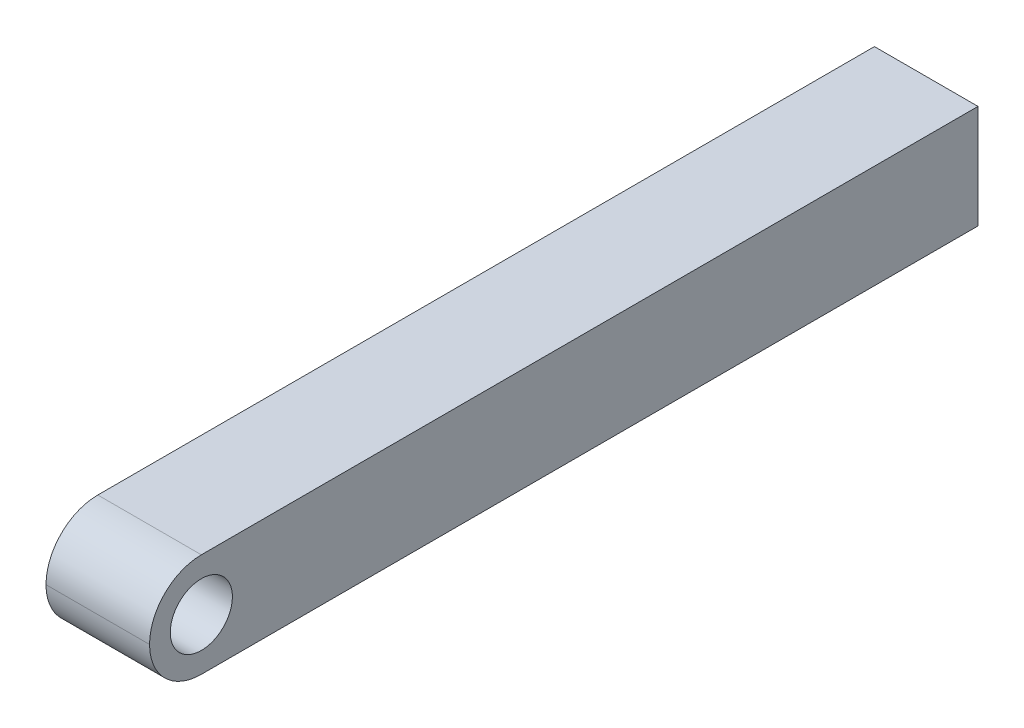
ISO-10303-21;
HEADER;
FILE_DESCRIPTION(('STEP AP214'),'2;1');
FILE_NAME('part.step','',(''),(''),'','','');
FILE_SCHEMA(('AUTOMOTIVE_DESIGN { 1 0 10303 214 1 1 1 1 }'));
ENDSEC;
DATA;
#1=APPLICATION_CONTEXT('core data for automotive mechanical design processes');
#2=APPLICATION_PROTOCOL_DEFINITION('international standard','automotive_design',2000,#1);
#3=PRODUCT_CONTEXT('',#1,'mechanical');
#4=PRODUCT('Part','Part','',(#3));
#5=PRODUCT_RELATED_PRODUCT_CATEGORY('part','',(#4));
#6=PRODUCT_DEFINITION_FORMATION('','',#4);
#7=PRODUCT_DEFINITION_CONTEXT('part definition',#1,'design');
#8=PRODUCT_DEFINITION('design','',#6,#7);
#9=PRODUCT_DEFINITION_SHAPE('','',#8);
#10=(LENGTH_UNIT() NAMED_UNIT(*) SI_UNIT(.MILLI.,.METRE.));
#11=(NAMED_UNIT(*) PLANE_ANGLE_UNIT() SI_UNIT($,.RADIAN.));
#12=(NAMED_UNIT(*) SI_UNIT($,.STERADIAN.) SOLID_ANGLE_UNIT());
#13=UNCERTAINTY_MEASURE_WITH_UNIT(LENGTH_MEASURE(1.E-05),#10,'distance_accuracy_value','');
#14=(GEOMETRIC_REPRESENTATION_CONTEXT(3) GLOBAL_UNCERTAINTY_ASSIGNED_CONTEXT((#13)) GLOBAL_UNIT_ASSIGNED_CONTEXT((#10,
#11,#12)) REPRESENTATION_CONTEXT('',''));
#15=CARTESIAN_POINT('',(0.,0.,0.));
#16=DIRECTION('',(0.,0.,1.));
#17=DIRECTION('',(1.,0.,0.));
#18=AXIS2_PLACEMENT_3D('',#15,#16,#17);
#19=CARTESIAN_POINT('',(0.,0.,20.32));
#20=DIRECTION('',(-1.,0.,0.));
#21=DIRECTION('',(0.,-1.,0.));
#22=AXIS2_PLACEMENT_3D('',#19,#20,#21);
#23=PLANE('',#22);
#24=CARTESIAN_POINT('',(0.,1.27,19.05));
#25=DIRECTION('',(1.,0.,0.));
#26=DIRECTION('',(0.,1.,0.));
#27=AXIS2_PLACEMENT_3D('',#24,#25,#26);
#28=CIRCLE('',#27,0.761999999999999);
#29=CARTESIAN_POINT('',(0.,2.032,19.05));
#30=VERTEX_POINT('',#29);
#31=EDGE_CURVE('E114',#30,#30,#28,.T.);
#32=ORIENTED_EDGE('',*,*,#31,.F.);
#33=EDGE_LOOP('',(#32));
#34=FACE_BOUND('',#33,.T.);
#35=CARTESIAN_POINT('',(0.,1.27,19.05));
#36=DIRECTION('',(-1.,0.,0.));
#37=DIRECTION('',(0.,-1.,0.));
#38=AXIS2_PLACEMENT_3D('',#35,#36,#37);
#39=CIRCLE('',#38,1.27);
#40=CARTESIAN_POINT('',(0.,2.54,19.05));
#41=VERTEX_POINT('',#40);
#42=CARTESIAN_POINT('',(0.,1.27,20.32));
#43=VERTEX_POINT('',#42);
#44=EDGE_CURVE('E93',#41,#43,#39,.F.);
#45=ORIENTED_EDGE('',*,*,#44,.T.);
#46=CARTESIAN_POINT('',(0.,1.27,19.05));
#47=DIRECTION('',(-1.,0.,0.));
#48=DIRECTION('',(0.,-1.,0.));
#49=AXIS2_PLACEMENT_3D('',#46,#47,#48);
#50=CIRCLE('',#49,1.27);
#51=CARTESIAN_POINT('',(0.,0.,19.05));
#52=VERTEX_POINT('',#51);
#53=EDGE_CURVE('E131',#43,#52,#50,.F.);
#54=ORIENTED_EDGE('',*,*,#53,.T.);
#55=DIRECTION('',(0.,0.,-1.));
#56=VECTOR('',#55,1.);
#57=CARTESIAN_POINT('',(0.,0.,20.32));
#58=LINE('',#57,#56);
#59=CARTESIAN_POINT('',(0.,0.,0.));
#60=VERTEX_POINT('',#59);
#61=EDGE_CURVE('E106',#52,#60,#58,.T.);
#62=ORIENTED_EDGE('',*,*,#61,.T.);
#63=DIRECTION('',(0.,1.,0.));
#64=VECTOR('',#63,1.);
#65=CARTESIAN_POINT('',(0.,0.,0.));
#66=LINE('',#65,#64);
#67=CARTESIAN_POINT('',(0.,2.54,0.));
#68=VERTEX_POINT('',#67);
#69=EDGE_CURVE('E100',#60,#68,#66,.T.);
#70=ORIENTED_EDGE('',*,*,#69,.T.);
#71=DIRECTION('',(0.,0.,-1.));
#72=VECTOR('',#71,1.);
#73=CARTESIAN_POINT('',(0.,2.54,20.32));
#74=LINE('',#73,#72);
#75=EDGE_CURVE('E83',#41,#68,#74,.T.);
#76=ORIENTED_EDGE('',*,*,#75,.F.);
#77=EDGE_LOOP('',(#45,#54,#62,#70,#76));
#78=FACE_BOUND('',#77,.T.);
#79=ADVANCED_FACE('F38',(#34,#78),#23,.F.);
#80=CARTESIAN_POINT('',(0.,2.54,20.32));
#81=DIRECTION('',(0.,-1.,0.));
#82=DIRECTION('',(1.,0.,0.));
#83=AXIS2_PLACEMENT_3D('',#80,#81,#82);
#84=PLANE('',#83);
#85=DIRECTION('',(0.,0.,-1.));
#86=VECTOR('',#85,1.);
#87=CARTESIAN_POINT('',(-2.54,2.54,20.32));
#88=LINE('',#87,#86);
#89=CARTESIAN_POINT('',(-2.54,2.54,19.05));
#90=VERTEX_POINT('',#89);
#91=CARTESIAN_POINT('',(-2.54,2.54,0.));
#92=VERTEX_POINT('',#91);
#93=EDGE_CURVE('E94',#90,#92,#88,.T.);
#94=ORIENTED_EDGE('',*,*,#93,.F.);
#95=DIRECTION('',(-1.,0.,0.));
#96=VECTOR('',#95,1.);
#97=CARTESIAN_POINT('',(0.,2.54,19.05));
#98=LINE('',#97,#96);
#99=EDGE_CURVE('E11',#90,#41,#98,.F.);
#100=ORIENTED_EDGE('',*,*,#99,.T.);
#101=ORIENTED_EDGE('',*,*,#75,.T.);
#102=DIRECTION('',(-1.,0.,0.));
#103=VECTOR('',#102,1.);
#104=CARTESIAN_POINT('',(0.,2.54,0.));
#105=LINE('',#104,#103);
#106=EDGE_CURVE('E86',#68,#92,#105,.T.);
#107=ORIENTED_EDGE('',*,*,#106,.T.);
#108=EDGE_LOOP('',(#94,#100,#101,#107));
#109=FACE_BOUND('',#108,.T.);
#110=ADVANCED_FACE('F85',(#109),#84,.F.);
#111=CARTESIAN_POINT('',(-2.54,0.,20.32));
#112=DIRECTION('',(1.,0.,0.));
#113=DIRECTION('',(0.,0.,-1.));
#114=AXIS2_PLACEMENT_3D('',#111,#112,#113);
#115=PLANE('',#114);
#116=CARTESIAN_POINT('',(-2.54,1.27,19.05));
#117=DIRECTION('',(1.,0.,0.));
#118=DIRECTION('',(0.,1.,0.));
#119=AXIS2_PLACEMENT_3D('',#116,#117,#118);
#120=CIRCLE('',#119,0.761999999999999);
#121=CARTESIAN_POINT('',(-2.54,2.032,19.05));
#122=VERTEX_POINT('',#121);
#123=EDGE_CURVE('E112',#122,#122,#120,.T.);
#124=ORIENTED_EDGE('',*,*,#123,.T.);
#125=EDGE_LOOP('',(#124));
#126=FACE_BOUND('',#125,.T.);
#127=DIRECTION('',(0.,0.,-1.));
#128=VECTOR('',#127,1.);
#129=CARTESIAN_POINT('',(-2.54,0.,20.32));
#130=LINE('',#129,#128);
#131=CARTESIAN_POINT('',(-2.54,0.,19.05));
#132=VERTEX_POINT('',#131);
#133=CARTESIAN_POINT('',(-2.54,0.,0.));
#134=VERTEX_POINT('',#133);
#135=EDGE_CURVE('E124',#132,#134,#130,.T.);
#136=ORIENTED_EDGE('',*,*,#135,.F.);
#137=CARTESIAN_POINT('',(-2.54,1.27,19.05));
#138=DIRECTION('',(1.,0.,0.));
#139=DIRECTION('',(0.,0.,-1.));
#140=AXIS2_PLACEMENT_3D('',#137,#138,#139);
#141=CIRCLE('',#140,1.27);
#142=CARTESIAN_POINT('',(-2.54,1.27,20.32));
#143=VERTEX_POINT('',#142);
#144=EDGE_CURVE('E48',#132,#143,#141,.F.);
#145=ORIENTED_EDGE('',*,*,#144,.T.);
#146=CARTESIAN_POINT('',(-2.54,1.27,19.05));
#147=DIRECTION('',(1.,0.,0.));
#148=DIRECTION('',(0.,0.,-1.));
#149=AXIS2_PLACEMENT_3D('',#146,#147,#148);
#150=CIRCLE('',#149,1.27);
#151=EDGE_CURVE('E55',#143,#90,#150,.F.);
#152=ORIENTED_EDGE('',*,*,#151,.T.);
#153=ORIENTED_EDGE('',*,*,#93,.T.);
#154=DIRECTION('',(0.,-1.,0.));
#155=VECTOR('',#154,1.);
#156=CARTESIAN_POINT('',(-2.54,0.,0.));
#157=LINE('',#156,#155);
#158=EDGE_CURVE('E102',#92,#134,#157,.T.);
#159=ORIENTED_EDGE('',*,*,#158,.T.);
#160=EDGE_LOOP('',(#136,#145,#152,#153,#159));
#161=FACE_BOUND('',#160,.T.);
#162=ADVANCED_FACE('F146',(#126,#161),#115,.F.);
#163=CARTESIAN_POINT('',(0.,0.,20.32));
#164=DIRECTION('',(0.,1.,0.));
#165=DIRECTION('',(0.,0.,1.));
#166=AXIS2_PLACEMENT_3D('',#163,#164,#165);
#167=PLANE('',#166);
#168=ORIENTED_EDGE('',*,*,#61,.F.);
#169=DIRECTION('',(1.,0.,0.));
#170=VECTOR('',#169,1.);
#171=CARTESIAN_POINT('',(-2.54,0.,19.05));
#172=LINE('',#171,#170);
#173=EDGE_CURVE('E134',#52,#132,#172,.F.);
#174=ORIENTED_EDGE('',*,*,#173,.T.);
#175=ORIENTED_EDGE('',*,*,#135,.T.);
#176=DIRECTION('',(1.,0.,0.));
#177=VECTOR('',#176,1.);
#178=CARTESIAN_POINT('',(0.,0.,0.));
#179=LINE('',#178,#177);
#180=EDGE_CURVE('E119',#134,#60,#179,.T.);
#181=ORIENTED_EDGE('',*,*,#180,.T.);
#182=EDGE_LOOP('',(#168,#174,#175,#181));
#183=FACE_BOUND('',#182,.T.);
#184=ADVANCED_FACE('F143',(#183),#167,.F.);
#185=CARTESIAN_POINT('',(0.,0.,0.));
#186=DIRECTION('',(0.,0.,1.));
#187=DIRECTION('',(1.,0.,0.));
#188=AXIS2_PLACEMENT_3D('',#185,#186,#187);
#189=PLANE('',#188);
#190=ORIENTED_EDGE('',*,*,#69,.F.);
#191=ORIENTED_EDGE('',*,*,#180,.F.);
#192=ORIENTED_EDGE('',*,*,#158,.F.);
#193=ORIENTED_EDGE('',*,*,#106,.F.);
#194=EDGE_LOOP('',(#190,#191,#192,#193));
#195=FACE_BOUND('',#194,.T.);
#196=ADVANCED_FACE('F98',(#195),#189,.F.);
#197=CARTESIAN_POINT('',(0.,1.27,19.05));
#198=DIRECTION('',(1.,0.,0.));
#199=DIRECTION('',(0.,1.,0.));
#200=AXIS2_PLACEMENT_3D('',#197,#198,#199);
#201=CYLINDRICAL_SURFACE('',#200,1.27);
#202=ORIENTED_EDGE('',*,*,#99,.F.);
#203=ORIENTED_EDGE('',*,*,#151,.F.);
#204=DIRECTION('',(-1.,0.,0.));
#205=VECTOR('',#204,1.);
#206=CARTESIAN_POINT('',(-2.54,1.27,20.32));
#207=LINE('',#206,#205);
#208=EDGE_CURVE('E42',#43,#143,#207,.T.);
#209=ORIENTED_EDGE('',*,*,#208,.F.);
#210=ORIENTED_EDGE('',*,*,#44,.F.);
#211=EDGE_LOOP('',(#202,#203,#209,#210));
#212=FACE_BOUND('',#211,.T.);
#213=ADVANCED_FACE('F40',(#212),#201,.T.);
#214=CARTESIAN_POINT('',(0.,1.27,19.05));
#215=DIRECTION('',(-1.,0.,0.));
#216=DIRECTION('',(0.,0.,1.));
#217=AXIS2_PLACEMENT_3D('',#214,#215,#216);
#218=CYLINDRICAL_SURFACE('',#217,1.27);
#219=ORIENTED_EDGE('',*,*,#144,.F.);
#220=ORIENTED_EDGE('',*,*,#173,.F.);
#221=ORIENTED_EDGE('',*,*,#53,.F.);
#222=ORIENTED_EDGE('',*,*,#208,.T.);
#223=EDGE_LOOP('',(#219,#220,#221,#222));
#224=FACE_BOUND('',#223,.T.);
#225=ADVANCED_FACE('F149',(#224),#218,.T.);
#226=CARTESIAN_POINT('',(-2.54,1.27,19.05));
#227=DIRECTION('',(1.,0.,0.));
#228=DIRECTION('',(0.,1.,0.));
#229=AXIS2_PLACEMENT_3D('',#226,#227,#228);
#230=CYLINDRICAL_SURFACE('',#229,0.761999999999999);
#231=ORIENTED_EDGE('',*,*,#123,.F.);
#232=EDGE_LOOP('',(#231));
#233=FACE_BOUND('',#232,.T.);
#234=ORIENTED_EDGE('',*,*,#31,.T.);
#235=EDGE_LOOP('',(#234));
#236=FACE_BOUND('',#235,.T.);
#237=ADVANCED_FACE('F151',(#233,#236),#230,.F.);
#238=CLOSED_SHELL('',(#79,#110,#162,#184,#196,#213,#225,#237));
#239=MANIFOLD_SOLID_BREP('B2',#238);
#240=ADVANCED_BREP_SHAPE_REPRESENTATION('',(#18,#239),#14);
#241=SHAPE_DEFINITION_REPRESENTATION(#9,#240);
ENDSEC;
END-ISO-10303-21;
